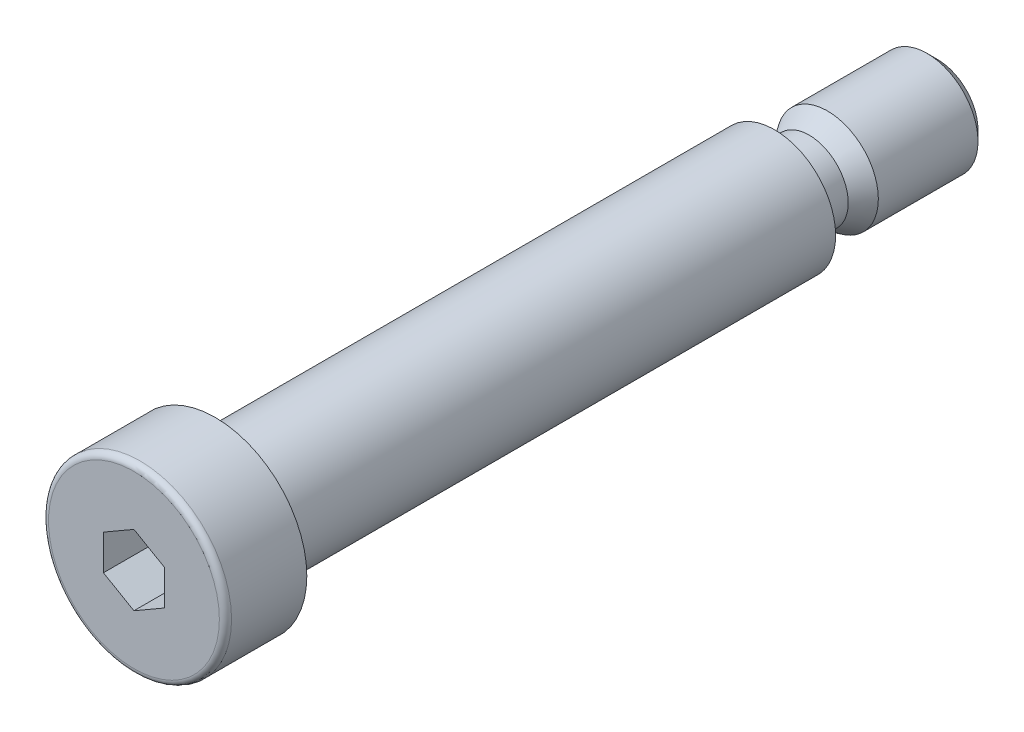
ISO-10303-21;
HEADER;
FILE_DESCRIPTION(('STEP AP214'),'2;1');
FILE_NAME('part.step','',(''),(''),'','','');
FILE_SCHEMA(('AUTOMOTIVE_DESIGN { 1 0 10303 214 1 1 1 1 }'));
ENDSEC;
DATA;
#1=APPLICATION_CONTEXT('core data for automotive mechanical design processes');
#2=APPLICATION_PROTOCOL_DEFINITION('international standard','automotive_design',2000,#1);
#3=PRODUCT_CONTEXT('',#1,'mechanical');
#4=PRODUCT('Part','Part','',(#3));
#5=PRODUCT_RELATED_PRODUCT_CATEGORY('part','',(#4));
#6=PRODUCT_DEFINITION_FORMATION('','',#4);
#7=PRODUCT_DEFINITION_CONTEXT('part definition',#1,'design');
#8=PRODUCT_DEFINITION('design','',#6,#7);
#9=PRODUCT_DEFINITION_SHAPE('','',#8);
#10=(LENGTH_UNIT() NAMED_UNIT(*) SI_UNIT(.MILLI.,.METRE.));
#11=(NAMED_UNIT(*) PLANE_ANGLE_UNIT() SI_UNIT($,.RADIAN.));
#12=(NAMED_UNIT(*) SI_UNIT($,.STERADIAN.) SOLID_ANGLE_UNIT());
#13=UNCERTAINTY_MEASURE_WITH_UNIT(LENGTH_MEASURE(1.E-05),#10,'distance_accuracy_value','');
#14=(GEOMETRIC_REPRESENTATION_CONTEXT(3) GLOBAL_UNCERTAINTY_ASSIGNED_CONTEXT((#13)) GLOBAL_UNIT_ASSIGNED_CONTEXT((#10,
#11,#12)) REPRESENTATION_CONTEXT('',''));
#15=CARTESIAN_POINT('',(0.,0.,0.));
#16=DIRECTION('',(0.,0.,1.));
#17=DIRECTION('',(1.,0.,0.));
#18=AXIS2_PLACEMENT_3D('',#15,#16,#17);
#19=CARTESIAN_POINT('',(0.,0.,35.5));
#20=DIRECTION('',(0.,0.,1.));
#21=DIRECTION('',(1.,0.,0.));
#22=AXIS2_PLACEMENT_3D('',#19,#20,#21);
#23=PLANE('',#22);
#24=CARTESIAN_POINT('',(0.,0.,35.5));
#25=DIRECTION('',(0.,0.,1.));
#26=DIRECTION('',(1.,0.,0.));
#27=AXIS2_PLACEMENT_3D('',#24,#25,#26);
#28=CIRCLE('',#27,8.4);
#29=CARTESIAN_POINT('',(8.4,0.,35.5));
#30=VERTEX_POINT('',#29);
#31=EDGE_CURVE('E42',#30,#30,#28,.T.);
#32=ORIENTED_EDGE('',*,*,#31,.T.);
#33=EDGE_LOOP('',(#32));
#34=FACE_BOUND('',#33,.T.);
#35=DIRECTION('',(0.,1.,0.));
#36=VECTOR('',#35,1.);
#37=CARTESIAN_POINT('',(3.,-1.73205080756888,35.5));
#38=LINE('',#37,#36);
#39=CARTESIAN_POINT('',(3.,-1.73205080756888,35.5));
#40=VERTEX_POINT('',#39);
#41=CARTESIAN_POINT('',(3.,1.73205080756888,35.5));
#42=VERTEX_POINT('',#41);
#43=EDGE_CURVE('E49',#40,#42,#38,.T.);
#44=ORIENTED_EDGE('',*,*,#43,.F.);
#45=DIRECTION('',(0.866025403784439,0.5,0.));
#46=VECTOR('',#45,1.);
#47=CARTESIAN_POINT('',(0.,-3.46410161513775,35.5));
#48=LINE('',#47,#46);
#49=CARTESIAN_POINT('',(0.,-3.46410161513775,35.5));
#50=VERTEX_POINT('',#49);
#51=EDGE_CURVE('E132',#50,#40,#48,.T.);
#52=ORIENTED_EDGE('',*,*,#51,.F.);
#53=DIRECTION('',(0.866025403784439,-0.5,0.));
#54=VECTOR('',#53,1.);
#55=CARTESIAN_POINT('',(-3.,-1.73205080756888,35.5));
#56=LINE('',#55,#54);
#57=CARTESIAN_POINT('',(-3.,-1.73205080756888,35.5));
#58=VERTEX_POINT('',#57);
#59=EDGE_CURVE('E130',#58,#50,#56,.T.);
#60=ORIENTED_EDGE('',*,*,#59,.F.);
#61=DIRECTION('',(0.,-1.,0.));
#62=VECTOR('',#61,1.);
#63=CARTESIAN_POINT('',(-3.,1.73205080756888,35.5));
#64=LINE('',#63,#62);
#65=CARTESIAN_POINT('',(-3.,1.73205080756888,35.5));
#66=VERTEX_POINT('',#65);
#67=EDGE_CURVE('E97',#66,#58,#64,.T.);
#68=ORIENTED_EDGE('',*,*,#67,.F.);
#69=DIRECTION('',(-0.866025403784439,-0.5,0.));
#70=VECTOR('',#69,1.);
#71=CARTESIAN_POINT('',(0.,3.46410161513775,35.5));
#72=LINE('',#71,#70);
#73=CARTESIAN_POINT('',(0.,3.46410161513775,35.5));
#74=VERTEX_POINT('',#73);
#75=EDGE_CURVE('E126',#74,#66,#72,.T.);
#76=ORIENTED_EDGE('',*,*,#75,.F.);
#77=DIRECTION('',(-0.866025403784439,0.5,0.));
#78=VECTOR('',#77,1.);
#79=CARTESIAN_POINT('',(3.,1.73205080756888,35.5));
#80=LINE('',#79,#78);
#81=EDGE_CURVE('E123',#42,#74,#80,.T.);
#82=ORIENTED_EDGE('',*,*,#81,.F.);
#83=EDGE_LOOP('',(#44,#52,#60,#68,#76,#82));
#84=FACE_BOUND('',#83,.T.);
#85=ADVANCED_FACE('F34',(#34,#84),#23,.T.);
#86=CARTESIAN_POINT('',(0.,0.,-43.5));
#87=DIRECTION('',(0.,0.,1.));
#88=DIRECTION('',(1.,0.,0.));
#89=AXIS2_PLACEMENT_3D('',#86,#87,#88);
#90=PLANE('',#89);
#91=CARTESIAN_POINT('',(0.,0.,-43.5));
#92=DIRECTION('',(0.,0.,1.));
#93=DIRECTION('',(1.,0.,0.));
#94=AXIS2_PLACEMENT_3D('',#91,#92,#93);
#95=CIRCLE('',#94,4.);
#96=CARTESIAN_POINT('',(4.,0.,-43.5));
#97=VERTEX_POINT('',#96);
#98=EDGE_CURVE('E162',#97,#97,#95,.T.);
#99=ORIENTED_EDGE('',*,*,#98,.F.);
#100=EDGE_LOOP('',(#99));
#101=FACE_BOUND('',#100,.T.);
#102=ADVANCED_FACE('F178',(#101),#90,.F.);
#103=CARTESIAN_POINT('',(0.,0.,-43.5));
#104=DIRECTION('',(0.,0.,1.));
#105=DIRECTION('',(1.,0.,0.));
#106=AXIS2_PLACEMENT_3D('',#103,#104,#105);
#107=CONICAL_SURFACE('',#106,4.,0.785398163397447);
#108=CARTESIAN_POINT('',(0.,0.,-42.5));
#109=DIRECTION('',(0.,0.,1.));
#110=DIRECTION('',(1.,0.,0.));
#111=AXIS2_PLACEMENT_3D('',#108,#109,#110);
#112=CIRCLE('',#111,5.);
#113=CARTESIAN_POINT('',(5.,0.,-42.5));
#114=VERTEX_POINT('',#113);
#115=EDGE_CURVE('E159',#114,#114,#112,.T.);
#116=ORIENTED_EDGE('',*,*,#115,.F.);
#117=EDGE_LOOP('',(#116));
#118=FACE_BOUND('',#117,.T.);
#119=ORIENTED_EDGE('',*,*,#98,.T.);
#120=EDGE_LOOP('',(#119));
#121=FACE_BOUND('',#120,.T.);
#122=ADVANCED_FACE('F182',(#118,#121),#107,.T.);
#123=CARTESIAN_POINT('',(0.,0.,35.5));
#124=DIRECTION('',(0.,0.,1.));
#125=DIRECTION('',(1.,0.,0.));
#126=AXIS2_PLACEMENT_3D('',#123,#124,#125);
#127=CYLINDRICAL_SURFACE('',#126,5.);
#128=CARTESIAN_POINT('',(0.,0.,-32.7));
#129=DIRECTION('',(0.,0.,1.));
#130=DIRECTION('',(1.,0.,0.));
#131=AXIS2_PLACEMENT_3D('',#128,#129,#130);
#132=CIRCLE('',#131,5.);
#133=CARTESIAN_POINT('',(5.,0.,-32.7));
#134=VERTEX_POINT('',#133);
#135=EDGE_CURVE('E156',#134,#134,#132,.T.);
#136=ORIENTED_EDGE('',*,*,#135,.F.);
#137=EDGE_LOOP('',(#136));
#138=FACE_BOUND('',#137,.T.);
#139=ORIENTED_EDGE('',*,*,#115,.T.);
#140=EDGE_LOOP('',(#139));
#141=FACE_BOUND('',#140,.T.);
#142=ADVANCED_FACE('F188',(#138,#141),#127,.T.);
#143=CARTESIAN_POINT('',(0.,0.,-32.7));
#144=DIRECTION('',(0.,0.,-1.));
#145=DIRECTION('',(-1.,0.,0.));
#146=AXIS2_PLACEMENT_3D('',#143,#144,#145);
#147=CONICAL_SURFACE('',#146,5.,0.566013910063244);
#148=CARTESIAN_POINT('',(0.,0.,-30.89));
#149=DIRECTION('',(0.,0.,1.));
#150=DIRECTION('',(1.,0.,0.));
#151=AXIS2_PLACEMENT_3D('',#148,#149,#150);
#152=CIRCLE('',#151,3.85000000000001);
#153=CARTESIAN_POINT('',(3.85000000000001,0.,-30.89));
#154=VERTEX_POINT('',#153);
#155=EDGE_CURVE('E153',#154,#154,#152,.T.);
#156=ORIENTED_EDGE('',*,*,#155,.F.);
#157=EDGE_LOOP('',(#156));
#158=FACE_BOUND('',#157,.T.);
#159=ORIENTED_EDGE('',*,*,#135,.T.);
#160=EDGE_LOOP('',(#159));
#161=FACE_BOUND('',#160,.T.);
#162=ADVANCED_FACE('F192',(#158,#161),#147,.T.);
#163=CARTESIAN_POINT('',(0.,0.,35.5));
#164=DIRECTION('',(0.,0.,1.));
#165=DIRECTION('',(1.,0.,0.));
#166=AXIS2_PLACEMENT_3D('',#163,#164,#165);
#167=CYLINDRICAL_SURFACE('',#166,3.85000000000001);
#168=ORIENTED_EDGE('',*,*,#155,.T.);
#169=EDGE_LOOP('',(#168));
#170=FACE_BOUND('',#169,.T.);
#171=CARTESIAN_POINT('',(0.,0.,-27.5));
#172=DIRECTION('',(0.,0.,1.));
#173=DIRECTION('',(1.,0.,0.));
#174=AXIS2_PLACEMENT_3D('',#171,#172,#173);
#175=CIRCLE('',#174,3.85000000000001);
#176=CARTESIAN_POINT('',(3.85000000000001,0.,-27.5));
#177=VERTEX_POINT('',#176);
#178=EDGE_CURVE('E150',#177,#177,#175,.T.);
#179=ORIENTED_EDGE('',*,*,#178,.F.);
#180=EDGE_LOOP('',(#179));
#181=FACE_BOUND('',#180,.T.);
#182=ADVANCED_FACE('F196',(#170,#181),#167,.T.);
#183=CARTESIAN_POINT('',(0.,0.,-27.5));
#184=DIRECTION('',(0.,0.,1.));
#185=DIRECTION('',(1.,0.,0.));
#186=AXIS2_PLACEMENT_3D('',#183,#184,#185);
#187=PLANE('',#186);
#188=CARTESIAN_POINT('',(0.,0.,-27.5));
#189=DIRECTION('',(0.,0.,1.));
#190=DIRECTION('',(1.,0.,0.));
#191=AXIS2_PLACEMENT_3D('',#188,#189,#190);
#192=CIRCLE('',#191,6.);
#193=CARTESIAN_POINT('',(6.,0.,-27.5));
#194=VERTEX_POINT('',#193);
#195=EDGE_CURVE('E147',#194,#194,#192,.T.);
#196=ORIENTED_EDGE('',*,*,#195,.F.);
#197=EDGE_LOOP('',(#196));
#198=FACE_BOUND('',#197,.T.);
#199=ORIENTED_EDGE('',*,*,#178,.T.);
#200=EDGE_LOOP('',(#199));
#201=FACE_BOUND('',#200,.T.);
#202=ADVANCED_FACE('F200',(#198,#201),#187,.F.);
#203=CARTESIAN_POINT('',(0.,0.,35.5));
#204=DIRECTION('',(0.,0.,1.));
#205=DIRECTION('',(1.,0.,0.));
#206=AXIS2_PLACEMENT_3D('',#203,#204,#205);
#207=CYLINDRICAL_SURFACE('',#206,6.);
#208=ORIENTED_EDGE('',*,*,#195,.T.);
#209=EDGE_LOOP('',(#208));
#210=FACE_BOUND('',#209,.T.);
#211=CARTESIAN_POINT('',(0.,0.,27.5));
#212=DIRECTION('',(0.,0.,1.));
#213=DIRECTION('',(1.,0.,0.));
#214=AXIS2_PLACEMENT_3D('',#211,#212,#213);
#215=CIRCLE('',#214,6.);
#216=CARTESIAN_POINT('',(6.,0.,27.5));
#217=VERTEX_POINT('',#216);
#218=EDGE_CURVE('E144',#217,#217,#215,.T.);
#219=ORIENTED_EDGE('',*,*,#218,.F.);
#220=EDGE_LOOP('',(#219));
#221=FACE_BOUND('',#220,.T.);
#222=ADVANCED_FACE('F204',(#210,#221),#207,.T.);
#223=CARTESIAN_POINT('',(0.,0.,27.5));
#224=DIRECTION('',(0.,0.,1.));
#225=DIRECTION('',(1.,0.,0.));
#226=AXIS2_PLACEMENT_3D('',#223,#224,#225);
#227=PLANE('',#226);
#228=CARTESIAN_POINT('',(0.,0.,27.5));
#229=DIRECTION('',(0.,0.,1.));
#230=DIRECTION('',(1.,0.,0.));
#231=AXIS2_PLACEMENT_3D('',#228,#229,#230);
#232=CIRCLE('',#231,9.);
#233=CARTESIAN_POINT('',(9.,0.,27.5));
#234=VERTEX_POINT('',#233);
#235=EDGE_CURVE('E136',#234,#234,#232,.T.);
#236=ORIENTED_EDGE('',*,*,#235,.F.);
#237=EDGE_LOOP('',(#236));
#238=FACE_BOUND('',#237,.T.);
#239=ORIENTED_EDGE('',*,*,#218,.T.);
#240=EDGE_LOOP('',(#239));
#241=FACE_BOUND('',#240,.T.);
#242=ADVANCED_FACE('F208',(#238,#241),#227,.F.);
#243=CARTESIAN_POINT('',(0.,0.,35.5));
#244=DIRECTION('',(0.,0.,1.));
#245=DIRECTION('',(1.,0.,0.));
#246=AXIS2_PLACEMENT_3D('',#243,#244,#245);
#247=CYLINDRICAL_SURFACE('',#246,9.);
#248=CARTESIAN_POINT('',(0.,0.,34.9));
#249=DIRECTION('',(0.,0.,1.));
#250=DIRECTION('',(1.,0.,0.));
#251=AXIS2_PLACEMENT_3D('',#248,#249,#250);
#252=CIRCLE('',#251,9.);
#253=CARTESIAN_POINT('',(9.,0.,34.9));
#254=VERTEX_POINT('',#253);
#255=EDGE_CURVE('E11',#254,#254,#252,.F.);
#256=ORIENTED_EDGE('',*,*,#255,.T.);
#257=EDGE_LOOP('',(#256));
#258=FACE_BOUND('',#257,.T.);
#259=ORIENTED_EDGE('',*,*,#235,.T.);
#260=EDGE_LOOP('',(#259));
#261=FACE_BOUND('',#260,.T.);
#262=ADVANCED_FACE('F212',(#258,#261),#247,.T.);
#263=CARTESIAN_POINT('',(3.,-1.73205080756888,30.6));
#264=DIRECTION('',(1.,0.,0.));
#265=DIRECTION('',(0.,1.,0.));
#266=AXIS2_PLACEMENT_3D('',#263,#264,#265);
#267=PLANE('',#266);
#268=ORIENTED_EDGE('',*,*,#43,.T.);
#269=DIRECTION('',(0.,0.,1.));
#270=VECTOR('',#269,1.);
#271=CARTESIAN_POINT('',(3.,1.73205080756888,30.6));
#272=LINE('',#271,#270);
#273=CARTESIAN_POINT('',(3.,1.73205080756888,30.6));
#274=VERTEX_POINT('',#273);
#275=EDGE_CURVE('E79',#274,#42,#272,.T.);
#276=ORIENTED_EDGE('',*,*,#275,.F.);
#277=DIRECTION('',(0.,1.,0.));
#278=VECTOR('',#277,1.);
#279=CARTESIAN_POINT('',(3.,-1.73205080756888,30.6));
#280=LINE('',#279,#278);
#281=CARTESIAN_POINT('',(3.,-1.73205080756888,30.6));
#282=VERTEX_POINT('',#281);
#283=EDGE_CURVE('E134',#282,#274,#280,.T.);
#284=ORIENTED_EDGE('',*,*,#283,.F.);
#285=DIRECTION('',(0.,0.,1.));
#286=VECTOR('',#285,1.);
#287=CARTESIAN_POINT('',(3.,-1.73205080756888,30.6));
#288=LINE('',#287,#286);
#289=EDGE_CURVE('E57',#282,#40,#288,.T.);
#290=ORIENTED_EDGE('',*,*,#289,.T.);
#291=EDGE_LOOP('',(#268,#276,#284,#290));
#292=FACE_BOUND('',#291,.T.);
#293=ADVANCED_FACE('F216',(#292),#267,.F.);
#294=CARTESIAN_POINT('',(0.,-3.46410161513775,30.6));
#295=DIRECTION('',(0.5,-0.866025403784439,0.));
#296=DIRECTION('',(0.866025403784439,0.5,0.));
#297=AXIS2_PLACEMENT_3D('',#294,#295,#296);
#298=PLANE('',#297);
#299=ORIENTED_EDGE('',*,*,#51,.T.);
#300=ORIENTED_EDGE('',*,*,#289,.F.);
#301=DIRECTION('',(0.866025403784439,0.5,0.));
#302=VECTOR('',#301,1.);
#303=CARTESIAN_POINT('',(0.,-3.46410161513775,30.6));
#304=LINE('',#303,#302);
#305=CARTESIAN_POINT('',(0.,-3.46410161513775,30.6));
#306=VERTEX_POINT('',#305);
#307=EDGE_CURVE('E109',#306,#282,#304,.T.);
#308=ORIENTED_EDGE('',*,*,#307,.F.);
#309=DIRECTION('',(0.,0.,1.));
#310=VECTOR('',#309,1.);
#311=CARTESIAN_POINT('',(0.,-3.46410161513775,30.6));
#312=LINE('',#311,#310);
#313=EDGE_CURVE('E101',#306,#50,#312,.T.);
#314=ORIENTED_EDGE('',*,*,#313,.T.);
#315=EDGE_LOOP('',(#299,#300,#308,#314));
#316=FACE_BOUND('',#315,.T.);
#317=ADVANCED_FACE('F220',(#316),#298,.F.);
#318=CARTESIAN_POINT('',(-3.,-1.73205080756888,30.6));
#319=DIRECTION('',(-0.5,-0.866025403784439,0.));
#320=DIRECTION('',(0.866025403784439,-0.5,0.));
#321=AXIS2_PLACEMENT_3D('',#318,#319,#320);
#322=PLANE('',#321);
#323=ORIENTED_EDGE('',*,*,#59,.T.);
#324=ORIENTED_EDGE('',*,*,#313,.F.);
#325=DIRECTION('',(0.866025403784439,-0.5,0.));
#326=VECTOR('',#325,1.);
#327=CARTESIAN_POINT('',(-3.,-1.73205080756888,30.6));
#328=LINE('',#327,#326);
#329=CARTESIAN_POINT('',(-3.,-1.73205080756888,30.6));
#330=VERTEX_POINT('',#329);
#331=EDGE_CURVE('E105',#330,#306,#328,.T.);
#332=ORIENTED_EDGE('',*,*,#331,.F.);
#333=DIRECTION('',(0.,0.,1.));
#334=VECTOR('',#333,1.);
#335=CARTESIAN_POINT('',(-3.,-1.73205080756888,30.6));
#336=LINE('',#335,#334);
#337=EDGE_CURVE('E90',#330,#58,#336,.T.);
#338=ORIENTED_EDGE('',*,*,#337,.T.);
#339=EDGE_LOOP('',(#323,#324,#332,#338));
#340=FACE_BOUND('',#339,.T.);
#341=ADVANCED_FACE('F106',(#340),#322,.F.);
#342=CARTESIAN_POINT('',(-3.,1.73205080756888,30.6));
#343=DIRECTION('',(-1.,0.,0.));
#344=DIRECTION('',(0.,0.,1.));
#345=AXIS2_PLACEMENT_3D('',#342,#343,#344);
#346=PLANE('',#345);
#347=ORIENTED_EDGE('',*,*,#67,.T.);
#348=ORIENTED_EDGE('',*,*,#337,.F.);
#349=DIRECTION('',(0.,-1.,0.));
#350=VECTOR('',#349,1.);
#351=CARTESIAN_POINT('',(-3.,1.73205080756888,30.6));
#352=LINE('',#351,#350);
#353=CARTESIAN_POINT('',(-3.,1.73205080756888,30.6));
#354=VERTEX_POINT('',#353);
#355=EDGE_CURVE('E94',#354,#330,#352,.T.);
#356=ORIENTED_EDGE('',*,*,#355,.F.);
#357=DIRECTION('',(0.,0.,1.));
#358=VECTOR('',#357,1.);
#359=CARTESIAN_POINT('',(-3.,1.73205080756888,30.6));
#360=LINE('',#359,#358);
#361=EDGE_CURVE('E102',#354,#66,#360,.T.);
#362=ORIENTED_EDGE('',*,*,#361,.T.);
#363=EDGE_LOOP('',(#347,#348,#356,#362));
#364=FACE_BOUND('',#363,.T.);
#365=ADVANCED_FACE('F92',(#364),#346,.F.);
#366=CARTESIAN_POINT('',(0.,3.46410161513775,30.6));
#367=DIRECTION('',(-0.5,0.866025403784439,0.));
#368=DIRECTION('',(-0.866025403784439,-0.5,0.));
#369=AXIS2_PLACEMENT_3D('',#366,#367,#368);
#370=PLANE('',#369);
#371=ORIENTED_EDGE('',*,*,#75,.T.);
#372=ORIENTED_EDGE('',*,*,#361,.F.);
#373=DIRECTION('',(-0.866025403784439,-0.5,0.));
#374=VECTOR('',#373,1.);
#375=CARTESIAN_POINT('',(0.,3.46410161513775,30.6));
#376=LINE('',#375,#374);
#377=CARTESIAN_POINT('',(0.,3.46410161513775,30.6));
#378=VERTEX_POINT('',#377);
#379=EDGE_CURVE('E115',#378,#354,#376,.T.);
#380=ORIENTED_EDGE('',*,*,#379,.F.);
#381=DIRECTION('',(0.,0.,1.));
#382=VECTOR('',#381,1.);
#383=CARTESIAN_POINT('',(0.,3.46410161513775,30.6));
#384=LINE('',#383,#382);
#385=EDGE_CURVE('E139',#378,#74,#384,.T.);
#386=ORIENTED_EDGE('',*,*,#385,.T.);
#387=EDGE_LOOP('',(#371,#372,#380,#386));
#388=FACE_BOUND('',#387,.T.);
#389=ADVANCED_FACE('F223',(#388),#370,.F.);
#390=CARTESIAN_POINT('',(3.,1.73205080756888,30.6));
#391=DIRECTION('',(0.5,0.866025403784439,0.));
#392=DIRECTION('',(-0.866025403784439,0.5,0.));
#393=AXIS2_PLACEMENT_3D('',#390,#391,#392);
#394=PLANE('',#393);
#395=ORIENTED_EDGE('',*,*,#81,.T.);
#396=ORIENTED_EDGE('',*,*,#385,.F.);
#397=DIRECTION('',(-0.866025403784439,0.5,0.));
#398=VECTOR('',#397,1.);
#399=CARTESIAN_POINT('',(3.,1.73205080756888,30.6));
#400=LINE('',#399,#398);
#401=EDGE_CURVE('E117',#274,#378,#400,.T.);
#402=ORIENTED_EDGE('',*,*,#401,.F.);
#403=ORIENTED_EDGE('',*,*,#275,.T.);
#404=EDGE_LOOP('',(#395,#396,#402,#403));
#405=FACE_BOUND('',#404,.T.);
#406=ADVANCED_FACE('F174',(#405),#394,.F.);
#407=CARTESIAN_POINT('',(0.,0.,30.6));
#408=DIRECTION('',(0.,0.,1.));
#409=DIRECTION('',(1.,0.,0.));
#410=AXIS2_PLACEMENT_3D('',#407,#408,#409);
#411=PLANE('',#410);
#412=ORIENTED_EDGE('',*,*,#283,.T.);
#413=ORIENTED_EDGE('',*,*,#401,.T.);
#414=ORIENTED_EDGE('',*,*,#379,.T.);
#415=ORIENTED_EDGE('',*,*,#355,.T.);
#416=ORIENTED_EDGE('',*,*,#331,.T.);
#417=ORIENTED_EDGE('',*,*,#307,.T.);
#418=EDGE_LOOP('',(#412,#413,#414,#415,#416,#417));
#419=FACE_BOUND('',#418,.T.);
#420=ADVANCED_FACE('F112',(#419),#411,.T.);
#421=CARTESIAN_POINT('',(0.,0.,34.9));
#422=DIRECTION('',(0.,0.,1.));
#423=DIRECTION('',(1.,0.,0.));
#424=AXIS2_PLACEMENT_3D('',#421,#422,#423);
#425=TOROIDAL_SURFACE('',#424,8.4,0.6);
#426=ORIENTED_EDGE('',*,*,#255,.F.);
#427=EDGE_LOOP('',(#426));
#428=FACE_BOUND('',#427,.T.);
#429=ORIENTED_EDGE('',*,*,#31,.F.);
#430=EDGE_LOOP('',(#429));
#431=FACE_BOUND('',#430,.T.);
#432=ADVANCED_FACE('F36',(#428,#431),#425,.T.);
#433=CLOSED_SHELL('',(#85,#102,#122,#142,#162,#182,#202,#222,#242,#262,#293,#317,#341,#365,#389,
#406,#420,#432));
#434=MANIFOLD_SOLID_BREP('B2',#433);
#435=ADVANCED_BREP_SHAPE_REPRESENTATION('',(#18,#434),#14);
#436=SHAPE_DEFINITION_REPRESENTATION(#9,#435);
ENDSEC;
END-ISO-10303-21;
